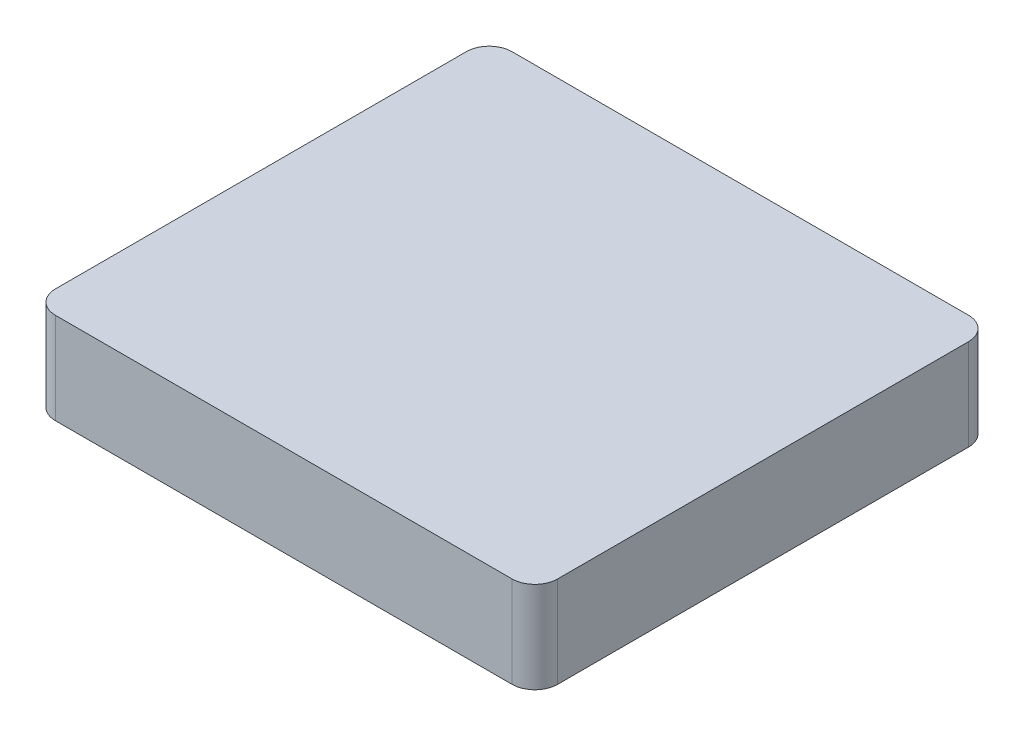
ISO-10303-21;
HEADER;
FILE_DESCRIPTION(('STEP AP214'),'2;1');
FILE_NAME('part.step','',(''),(''),'','','');
FILE_SCHEMA(('AUTOMOTIVE_DESIGN { 1 0 10303 214 1 1 1 1 }'));
ENDSEC;
DATA;
#1=APPLICATION_CONTEXT('core data for automotive mechanical design processes');
#2=APPLICATION_PROTOCOL_DEFINITION('international standard','automotive_design',2000,#1);
#3=PRODUCT_CONTEXT('',#1,'mechanical');
#4=PRODUCT('Part','Part','',(#3));
#5=PRODUCT_RELATED_PRODUCT_CATEGORY('part','',(#4));
#6=PRODUCT_DEFINITION_FORMATION('','',#4);
#7=PRODUCT_DEFINITION_CONTEXT('part definition',#1,'design');
#8=PRODUCT_DEFINITION('design','',#6,#7);
#9=PRODUCT_DEFINITION_SHAPE('','',#8);
#10=(LENGTH_UNIT() NAMED_UNIT(*) SI_UNIT(.MILLI.,.METRE.));
#11=(NAMED_UNIT(*) PLANE_ANGLE_UNIT() SI_UNIT($,.RADIAN.));
#12=(NAMED_UNIT(*) SI_UNIT($,.STERADIAN.) SOLID_ANGLE_UNIT());
#13=UNCERTAINTY_MEASURE_WITH_UNIT(LENGTH_MEASURE(1.E-05),#10,'distance_accuracy_value','');
#14=(GEOMETRIC_REPRESENTATION_CONTEXT(3) GLOBAL_UNCERTAINTY_ASSIGNED_CONTEXT((#13)) GLOBAL_UNIT_ASSIGNED_CONTEXT((#10,
#11,#12)) REPRESENTATION_CONTEXT('',''));
#15=CARTESIAN_POINT('',(0.,0.,0.));
#16=DIRECTION('',(0.,0.,1.));
#17=DIRECTION('',(1.,0.,0.));
#18=AXIS2_PLACEMENT_3D('',#15,#16,#17);
#19=CARTESIAN_POINT('',(0.,2.54,-12.7));
#20=DIRECTION('',(1.,0.,0.));
#21=DIRECTION('',(0.,0.,-1.));
#22=AXIS2_PLACEMENT_3D('',#19,#20,#21);
#23=PLANE('',#22);
#24=DIRECTION('',(0.,0.,1.));
#25=VECTOR('',#24,1.);
#26=CARTESIAN_POINT('',(0.,2.54,-12.7));
#27=LINE('',#26,#25);
#28=CARTESIAN_POINT('',(0.,2.54,-12.065));
#29=VERTEX_POINT('',#28);
#30=CARTESIAN_POINT('',(0.,2.54,-0.635));
#31=VERTEX_POINT('',#30);
#32=EDGE_CURVE('E162',#29,#31,#27,.T.);
#33=ORIENTED_EDGE('',*,*,#32,.F.);
#34=DIRECTION('',(0.,-1.,0.));
#35=VECTOR('',#34,1.);
#36=CARTESIAN_POINT('',(0.,2.54,-12.065));
#37=LINE('',#36,#35);
#38=CARTESIAN_POINT('',(0.,0.,-12.065));
#39=VERTEX_POINT('',#38);
#40=EDGE_CURVE('E187',#29,#39,#37,.T.);
#41=ORIENTED_EDGE('',*,*,#40,.T.);
#42=DIRECTION('',(0.,0.,1.));
#43=VECTOR('',#42,1.);
#44=CARTESIAN_POINT('',(0.,0.,-12.7));
#45=LINE('',#44,#43);
#46=CARTESIAN_POINT('',(0.,0.,-0.635));
#47=VERTEX_POINT('',#46);
#48=EDGE_CURVE('E175',#39,#47,#45,.T.);
#49=ORIENTED_EDGE('',*,*,#48,.T.);
#50=DIRECTION('',(0.,-1.,0.));
#51=VECTOR('',#50,1.);
#52=CARTESIAN_POINT('',(0.,2.54,-0.635));
#53=LINE('',#52,#51);
#54=EDGE_CURVE('E174',#47,#31,#53,.F.);
#55=ORIENTED_EDGE('',*,*,#54,.T.);
#56=EDGE_LOOP('',(#33,#41,#49,#55));
#57=FACE_BOUND('',#56,.T.);
#58=ADVANCED_FACE('F33',(#57),#23,.F.);
#59=CARTESIAN_POINT('',(0.,2.54,0.));
#60=DIRECTION('',(0.,0.,-1.));
#61=DIRECTION('',(-1.,0.,0.));
#62=AXIS2_PLACEMENT_3D('',#59,#60,#61);
#63=PLANE('',#62);
#64=DIRECTION('',(1.,0.,0.));
#65=VECTOR('',#64,1.);
#66=CARTESIAN_POINT('',(0.,0.,0.));
#67=LINE('',#66,#65);
#68=CARTESIAN_POINT('',(0.635,0.,0.));
#69=VERTEX_POINT('',#68);
#70=CARTESIAN_POINT('',(13.335,0.,0.));
#71=VERTEX_POINT('',#70);
#72=EDGE_CURVE('E178',#69,#71,#67,.T.);
#73=ORIENTED_EDGE('',*,*,#72,.T.);
#74=DIRECTION('',(0.,-1.,0.));
#75=VECTOR('',#74,1.);
#76=CARTESIAN_POINT('',(13.335,2.54,0.));
#77=LINE('',#76,#75);
#78=CARTESIAN_POINT('',(13.335,2.54,0.));
#79=VERTEX_POINT('',#78);
#80=EDGE_CURVE('E41',#71,#79,#77,.F.);
#81=ORIENTED_EDGE('',*,*,#80,.T.);
#82=DIRECTION('',(1.,0.,0.));
#83=VECTOR('',#82,1.);
#84=CARTESIAN_POINT('',(0.,2.54,0.));
#85=LINE('',#84,#83);
#86=CARTESIAN_POINT('',(0.635,2.54,0.));
#87=VERTEX_POINT('',#86);
#88=EDGE_CURVE('E165',#87,#79,#85,.T.);
#89=ORIENTED_EDGE('',*,*,#88,.F.);
#90=DIRECTION('',(0.,-1.,0.));
#91=VECTOR('',#90,1.);
#92=CARTESIAN_POINT('',(0.635,2.54,0.));
#93=LINE('',#92,#91);
#94=EDGE_CURVE('E215',#87,#69,#93,.T.);
#95=ORIENTED_EDGE('',*,*,#94,.T.);
#96=EDGE_LOOP('',(#73,#81,#89,#95));
#97=FACE_BOUND('',#96,.T.);
#98=ADVANCED_FACE('F220',(#97),#63,.F.);
#99=CARTESIAN_POINT('',(13.97,2.54,0.));
#100=DIRECTION('',(-1.,0.,0.));
#101=DIRECTION('',(0.,0.,1.));
#102=AXIS2_PLACEMENT_3D('',#99,#100,#101);
#103=PLANE('',#102);
#104=DIRECTION('',(0.,0.,-1.));
#105=VECTOR('',#104,1.);
#106=CARTESIAN_POINT('',(13.97,0.,0.));
#107=LINE('',#106,#105);
#108=CARTESIAN_POINT('',(13.97,0.,-0.635));
#109=VERTEX_POINT('',#108);
#110=CARTESIAN_POINT('',(13.97,0.,-12.065));
#111=VERTEX_POINT('',#110);
#112=EDGE_CURVE('E182',#109,#111,#107,.T.);
#113=ORIENTED_EDGE('',*,*,#112,.T.);
#114=DIRECTION('',(0.,-1.,0.));
#115=VECTOR('',#114,1.);
#116=CARTESIAN_POINT('',(13.97,2.54,-12.065));
#117=LINE('',#116,#115);
#118=CARTESIAN_POINT('',(13.97,2.54,-12.065));
#119=VERTEX_POINT('',#118);
#120=EDGE_CURVE('E56',#111,#119,#117,.F.);
#121=ORIENTED_EDGE('',*,*,#120,.T.);
#122=DIRECTION('',(0.,0.,-1.));
#123=VECTOR('',#122,1.);
#124=CARTESIAN_POINT('',(13.97,2.54,0.));
#125=LINE('',#124,#123);
#126=CARTESIAN_POINT('',(13.97,2.54,-0.635));
#127=VERTEX_POINT('',#126);
#128=EDGE_CURVE('E169',#127,#119,#125,.T.);
#129=ORIENTED_EDGE('',*,*,#128,.F.);
#130=DIRECTION('',(0.,-1.,0.));
#131=VECTOR('',#130,1.);
#132=CARTESIAN_POINT('',(13.97,2.54,-0.635));
#133=LINE('',#132,#131);
#134=EDGE_CURVE('E211',#127,#109,#133,.T.);
#135=ORIENTED_EDGE('',*,*,#134,.T.);
#136=EDGE_LOOP('',(#113,#121,#129,#135));
#137=FACE_BOUND('',#136,.T.);
#138=ADVANCED_FACE('F231',(#137),#103,.F.);
#139=CARTESIAN_POINT('',(13.97,2.54,-12.7));
#140=DIRECTION('',(0.,0.,1.));
#141=DIRECTION('',(1.,0.,0.));
#142=AXIS2_PLACEMENT_3D('',#139,#140,#141);
#143=PLANE('',#142);
#144=DIRECTION('',(-1.,0.,0.));
#145=VECTOR('',#144,1.);
#146=CARTESIAN_POINT('',(13.97,0.,-12.7));
#147=LINE('',#146,#145);
#148=CARTESIAN_POINT('',(13.335,0.,-12.7));
#149=VERTEX_POINT('',#148);
#150=CARTESIAN_POINT('',(0.634999999999995,0.,-12.7));
#151=VERTEX_POINT('',#150);
#152=EDGE_CURVE('E166',#149,#151,#147,.T.);
#153=ORIENTED_EDGE('',*,*,#152,.T.);
#154=DIRECTION('',(0.,-1.,0.));
#155=VECTOR('',#154,1.);
#156=CARTESIAN_POINT('',(0.634999999999995,2.54,-12.7));
#157=LINE('',#156,#155);
#158=CARTESIAN_POINT('',(0.634999999999995,2.54,-12.7));
#159=VERTEX_POINT('',#158);
#160=EDGE_CURVE('E201',#151,#159,#157,.F.);
#161=ORIENTED_EDGE('',*,*,#160,.T.);
#162=DIRECTION('',(-1.,0.,0.));
#163=VECTOR('',#162,1.);
#164=CARTESIAN_POINT('',(13.97,2.54,-12.7));
#165=LINE('',#164,#163);
#166=CARTESIAN_POINT('',(13.335,2.54,-12.7));
#167=VERTEX_POINT('',#166);
#168=EDGE_CURVE('E171',#167,#159,#165,.T.);
#169=ORIENTED_EDGE('',*,*,#168,.F.);
#170=DIRECTION('',(0.,-1.,0.));
#171=VECTOR('',#170,1.);
#172=CARTESIAN_POINT('',(13.335,2.54,-12.7));
#173=LINE('',#172,#171);
#174=EDGE_CURVE('E198',#167,#149,#173,.T.);
#175=ORIENTED_EDGE('',*,*,#174,.T.);
#176=EDGE_LOOP('',(#153,#161,#169,#175));
#177=FACE_BOUND('',#176,.T.);
#178=ADVANCED_FACE('F242',(#177),#143,.F.);
#179=CARTESIAN_POINT('',(0.,2.54,0.));
#180=DIRECTION('',(0.,1.,0.));
#181=DIRECTION('',(0.,0.,1.));
#182=AXIS2_PLACEMENT_3D('',#179,#180,#181);
#183=PLANE('',#182);
#184=ORIENTED_EDGE('',*,*,#168,.T.);
#185=CARTESIAN_POINT('',(0.634999999999995,2.54,-12.065));
#186=DIRECTION('',(0.,1.,0.));
#187=DIRECTION('',(0.,0.,1.));
#188=AXIS2_PLACEMENT_3D('',#185,#186,#187);
#189=CIRCLE('',#188,0.635);
#190=EDGE_CURVE('E209',#159,#29,#189,.T.);
#191=ORIENTED_EDGE('',*,*,#190,.T.);
#192=ORIENTED_EDGE('',*,*,#32,.T.);
#193=CARTESIAN_POINT('',(0.635,2.54,-0.635));
#194=DIRECTION('',(0.,1.,0.));
#195=DIRECTION('',(0.,0.,1.));
#196=AXIS2_PLACEMENT_3D('',#193,#194,#195);
#197=CIRCLE('',#196,0.635);
#198=EDGE_CURVE('E203',#31,#87,#197,.T.);
#199=ORIENTED_EDGE('',*,*,#198,.T.);
#200=ORIENTED_EDGE('',*,*,#88,.T.);
#201=CARTESIAN_POINT('',(13.335,2.54,-0.635));
#202=DIRECTION('',(0.,1.,0.));
#203=DIRECTION('',(0.,0.,1.));
#204=AXIS2_PLACEMENT_3D('',#201,#202,#203);
#205=CIRCLE('',#204,0.635);
#206=EDGE_CURVE('E205',#79,#127,#205,.T.);
#207=ORIENTED_EDGE('',*,*,#206,.T.);
#208=ORIENTED_EDGE('',*,*,#128,.T.);
#209=CARTESIAN_POINT('',(13.335,2.54,-12.065));
#210=DIRECTION('',(0.,1.,0.));
#211=DIRECTION('',(0.,0.,1.));
#212=AXIS2_PLACEMENT_3D('',#209,#210,#211);
#213=CIRCLE('',#212,0.635);
#214=EDGE_CURVE('E207',#119,#167,#213,.T.);
#215=ORIENTED_EDGE('',*,*,#214,.T.);
#216=EDGE_LOOP('',(#184,#191,#192,#199,#200,#207,#208,#215));
#217=FACE_BOUND('',#216,.T.);
#218=ADVANCED_FACE('F226',(#217),#183,.T.);
#219=CARTESIAN_POINT('',(0.,0.,0.));
#220=DIRECTION('',(0.,1.,0.));
#221=DIRECTION('',(0.,0.,1.));
#222=AXIS2_PLACEMENT_3D('',#219,#220,#221);
#223=PLANE('',#222);
#224=DIRECTION('',(-1.,0.,0.));
#225=VECTOR('',#224,1.);
#226=CARTESIAN_POINT('',(13.97,0.,-12.065));
#227=LINE('',#226,#225);
#228=CARTESIAN_POINT('',(13.335,0.,-12.065));
#229=VERTEX_POINT('',#228);
#230=CARTESIAN_POINT('',(0.634999999999995,0.,-12.065));
#231=VERTEX_POINT('',#230);
#232=EDGE_CURVE('E134',#229,#231,#227,.T.);
#233=ORIENTED_EDGE('',*,*,#232,.T.);
#234=DIRECTION('',(0.,0.,1.));
#235=VECTOR('',#234,1.);
#236=CARTESIAN_POINT('',(0.634999999999995,0.,-12.7));
#237=LINE('',#236,#235);
#238=CARTESIAN_POINT('',(0.635,0.,-0.635));
#239=VERTEX_POINT('',#238);
#240=EDGE_CURVE('E140',#231,#239,#237,.T.);
#241=ORIENTED_EDGE('',*,*,#240,.T.);
#242=DIRECTION('',(1.,0.,0.));
#243=VECTOR('',#242,1.);
#244=CARTESIAN_POINT('',(0.,0.,-0.635));
#245=LINE('',#244,#243);
#246=CARTESIAN_POINT('',(13.335,0.,-0.635));
#247=VERTEX_POINT('',#246);
#248=EDGE_CURVE('E156',#239,#247,#245,.T.);
#249=ORIENTED_EDGE('',*,*,#248,.T.);
#250=DIRECTION('',(0.,0.,-1.));
#251=VECTOR('',#250,1.);
#252=CARTESIAN_POINT('',(13.335,0.,0.));
#253=LINE('',#252,#251);
#254=EDGE_CURVE('E48',#247,#229,#253,.T.);
#255=ORIENTED_EDGE('',*,*,#254,.T.);
#256=EDGE_LOOP('',(#233,#241,#249,#255));
#257=FACE_BOUND('',#256,.T.);
#258=ORIENTED_EDGE('',*,*,#48,.F.);
#259=CARTESIAN_POINT('',(0.634999999999995,0.,-12.065));
#260=DIRECTION('',(0.,1.,0.));
#261=DIRECTION('',(0.,0.,1.));
#262=AXIS2_PLACEMENT_3D('',#259,#260,#261);
#263=CIRCLE('',#262,0.635);
#264=EDGE_CURVE('E196',#39,#151,#263,.F.);
#265=ORIENTED_EDGE('',*,*,#264,.T.);
#266=ORIENTED_EDGE('',*,*,#152,.F.);
#267=CARTESIAN_POINT('',(13.335,0.,-12.065));
#268=DIRECTION('',(0.,1.,0.));
#269=DIRECTION('',(0.,0.,1.));
#270=AXIS2_PLACEMENT_3D('',#267,#268,#269);
#271=CIRCLE('',#270,0.635);
#272=EDGE_CURVE('E194',#149,#111,#271,.F.);
#273=ORIENTED_EDGE('',*,*,#272,.T.);
#274=ORIENTED_EDGE('',*,*,#112,.F.);
#275=CARTESIAN_POINT('',(13.335,0.,-0.635));
#276=DIRECTION('',(0.,1.,0.));
#277=DIRECTION('',(0.,0.,1.));
#278=AXIS2_PLACEMENT_3D('',#275,#276,#277);
#279=CIRCLE('',#278,0.635);
#280=EDGE_CURVE('E192',#109,#71,#279,.F.);
#281=ORIENTED_EDGE('',*,*,#280,.T.);
#282=ORIENTED_EDGE('',*,*,#72,.F.);
#283=CARTESIAN_POINT('',(0.635,0.,-0.635));
#284=DIRECTION('',(0.,1.,0.));
#285=DIRECTION('',(0.,0.,1.));
#286=AXIS2_PLACEMENT_3D('',#283,#284,#285);
#287=CIRCLE('',#286,0.635);
#288=EDGE_CURVE('E190',#69,#47,#287,.F.);
#289=ORIENTED_EDGE('',*,*,#288,.T.);
#290=EDGE_LOOP('',(#258,#265,#266,#273,#274,#281,#282,#289));
#291=FACE_BOUND('',#290,.T.);
#292=ADVANCED_FACE('F234',(#257,#291),#223,.F.);
#293=CARTESIAN_POINT('',(0.634999999999995,2.54,-12.065));
#294=DIRECTION('',(0.,-1.,0.));
#295=DIRECTION('',(0.,0.,-1.));
#296=AXIS2_PLACEMENT_3D('',#293,#294,#295);
#297=CYLINDRICAL_SURFACE('',#296,0.635);
#298=ORIENTED_EDGE('',*,*,#190,.F.);
#299=ORIENTED_EDGE('',*,*,#160,.F.);
#300=ORIENTED_EDGE('',*,*,#264,.F.);
#301=ORIENTED_EDGE('',*,*,#40,.F.);
#302=EDGE_LOOP('',(#298,#299,#300,#301));
#303=FACE_BOUND('',#302,.T.);
#304=ADVANCED_FACE('F248',(#303),#297,.T.);
#305=CARTESIAN_POINT('',(13.335,2.54,-12.065));
#306=DIRECTION('',(0.,-1.,0.));
#307=DIRECTION('',(0.,0.,-1.));
#308=AXIS2_PLACEMENT_3D('',#305,#306,#307);
#309=CYLINDRICAL_SURFACE('',#308,0.635);
#310=ORIENTED_EDGE('',*,*,#214,.F.);
#311=ORIENTED_EDGE('',*,*,#120,.F.);
#312=ORIENTED_EDGE('',*,*,#272,.F.);
#313=ORIENTED_EDGE('',*,*,#174,.F.);
#314=EDGE_LOOP('',(#310,#311,#312,#313));
#315=FACE_BOUND('',#314,.T.);
#316=ADVANCED_FACE('F239',(#315),#309,.T.);
#317=CARTESIAN_POINT('',(13.335,2.54,-0.635));
#318=DIRECTION('',(0.,-1.,0.));
#319=DIRECTION('',(0.,0.,-1.));
#320=AXIS2_PLACEMENT_3D('',#317,#318,#319);
#321=CYLINDRICAL_SURFACE('',#320,0.635);
#322=ORIENTED_EDGE('',*,*,#206,.F.);
#323=ORIENTED_EDGE('',*,*,#80,.F.);
#324=ORIENTED_EDGE('',*,*,#280,.F.);
#325=ORIENTED_EDGE('',*,*,#134,.F.);
#326=EDGE_LOOP('',(#322,#323,#324,#325));
#327=FACE_BOUND('',#326,.T.);
#328=ADVANCED_FACE('F229',(#327),#321,.T.);
#329=CARTESIAN_POINT('',(0.635,2.54,-0.635));
#330=DIRECTION('',(0.,-1.,0.));
#331=DIRECTION('',(0.,0.,-1.));
#332=AXIS2_PLACEMENT_3D('',#329,#330,#331);
#333=CYLINDRICAL_SURFACE('',#332,0.635);
#334=ORIENTED_EDGE('',*,*,#198,.F.);
#335=ORIENTED_EDGE('',*,*,#54,.F.);
#336=ORIENTED_EDGE('',*,*,#288,.F.);
#337=ORIENTED_EDGE('',*,*,#94,.F.);
#338=EDGE_LOOP('',(#334,#335,#336,#337));
#339=FACE_BOUND('',#338,.T.);
#340=ADVANCED_FACE('F35',(#339),#333,.T.);
#341=CARTESIAN_POINT('',(0.634999999999995,2.54,-12.7));
#342=DIRECTION('',(1.,0.,0.));
#343=DIRECTION('',(0.,0.,-1.));
#344=AXIS2_PLACEMENT_3D('',#341,#342,#343);
#345=PLANE('',#344);
#346=DIRECTION('',(0.,0.,1.));
#347=VECTOR('',#346,1.);
#348=CARTESIAN_POINT('',(0.634999999999995,1.905,-12.7));
#349=LINE('',#348,#347);
#350=CARTESIAN_POINT('',(0.634999999999995,1.905,-12.065));
#351=VERTEX_POINT('',#350);
#352=CARTESIAN_POINT('',(0.635,1.905,-0.635));
#353=VERTEX_POINT('',#352);
#354=EDGE_CURVE('E124',#351,#353,#349,.T.);
#355=ORIENTED_EDGE('',*,*,#354,.T.);
#356=DIRECTION('',(0.,1.,0.));
#357=VECTOR('',#356,1.);
#358=CARTESIAN_POINT('',(0.635,2.54,-0.635));
#359=LINE('',#358,#357);
#360=EDGE_CURVE('E145',#239,#353,#359,.T.);
#361=ORIENTED_EDGE('',*,*,#360,.F.);
#362=ORIENTED_EDGE('',*,*,#240,.F.);
#363=DIRECTION('',(0.,1.,0.));
#364=VECTOR('',#363,1.);
#365=CARTESIAN_POINT('',(0.634999999999995,2.54,-12.065));
#366=LINE('',#365,#364);
#367=EDGE_CURVE('E137',#231,#351,#366,.T.);
#368=ORIENTED_EDGE('',*,*,#367,.T.);
#369=EDGE_LOOP('',(#355,#361,#362,#368));
#370=FACE_BOUND('',#369,.T.);
#371=ADVANCED_FACE('F138',(#370),#345,.T.);
#372=CARTESIAN_POINT('',(0.,2.54,-0.635));
#373=DIRECTION('',(0.,0.,-1.));
#374=DIRECTION('',(-1.,0.,0.));
#375=AXIS2_PLACEMENT_3D('',#372,#373,#374);
#376=PLANE('',#375);
#377=ORIENTED_EDGE('',*,*,#248,.F.);
#378=ORIENTED_EDGE('',*,*,#360,.T.);
#379=DIRECTION('',(1.,0.,0.));
#380=VECTOR('',#379,1.);
#381=CARTESIAN_POINT('',(0.,1.905,-0.635));
#382=LINE('',#381,#380);
#383=CARTESIAN_POINT('',(13.335,1.905,-0.635));
#384=VERTEX_POINT('',#383);
#385=EDGE_CURVE('E131',#353,#384,#382,.T.);
#386=ORIENTED_EDGE('',*,*,#385,.T.);
#387=DIRECTION('',(0.,1.,0.));
#388=VECTOR('',#387,1.);
#389=CARTESIAN_POINT('',(13.335,2.54,-0.635));
#390=LINE('',#389,#388);
#391=EDGE_CURVE('E179',#247,#384,#390,.T.);
#392=ORIENTED_EDGE('',*,*,#391,.F.);
#393=EDGE_LOOP('',(#377,#378,#386,#392));
#394=FACE_BOUND('',#393,.T.);
#395=ADVANCED_FACE('F257',(#394),#376,.T.);
#396=CARTESIAN_POINT('',(13.335,2.54,0.));
#397=DIRECTION('',(-1.,0.,0.));
#398=DIRECTION('',(0.,0.,1.));
#399=AXIS2_PLACEMENT_3D('',#396,#397,#398);
#400=PLANE('',#399);
#401=ORIENTED_EDGE('',*,*,#254,.F.);
#402=ORIENTED_EDGE('',*,*,#391,.T.);
#403=DIRECTION('',(0.,0.,-1.));
#404=VECTOR('',#403,1.);
#405=CARTESIAN_POINT('',(13.335,1.905,0.));
#406=LINE('',#405,#404);
#407=CARTESIAN_POINT('',(13.335,1.905,-12.065));
#408=VERTEX_POINT('',#407);
#409=EDGE_CURVE('E149',#384,#408,#406,.T.);
#410=ORIENTED_EDGE('',*,*,#409,.T.);
#411=DIRECTION('',(0.,1.,0.));
#412=VECTOR('',#411,1.);
#413=CARTESIAN_POINT('',(13.335,2.54,-12.065));
#414=LINE('',#413,#412);
#415=EDGE_CURVE('E144',#229,#408,#414,.T.);
#416=ORIENTED_EDGE('',*,*,#415,.F.);
#417=EDGE_LOOP('',(#401,#402,#410,#416));
#418=FACE_BOUND('',#417,.T.);
#419=ADVANCED_FACE('F309',(#418),#400,.T.);
#420=CARTESIAN_POINT('',(13.97,2.54,-12.065));
#421=DIRECTION('',(0.,0.,1.));
#422=DIRECTION('',(1.,0.,0.));
#423=AXIS2_PLACEMENT_3D('',#420,#421,#422);
#424=PLANE('',#423);
#425=ORIENTED_EDGE('',*,*,#232,.F.);
#426=ORIENTED_EDGE('',*,*,#415,.T.);
#427=DIRECTION('',(-1.,0.,0.));
#428=VECTOR('',#427,1.);
#429=CARTESIAN_POINT('',(13.97,1.905,-12.065));
#430=LINE('',#429,#428);
#431=EDGE_CURVE('E128',#408,#351,#430,.T.);
#432=ORIENTED_EDGE('',*,*,#431,.T.);
#433=ORIENTED_EDGE('',*,*,#367,.F.);
#434=EDGE_LOOP('',(#425,#426,#432,#433));
#435=FACE_BOUND('',#434,.T.);
#436=ADVANCED_FACE('F147',(#435),#424,.T.);
#437=CARTESIAN_POINT('',(0.,1.905,0.));
#438=DIRECTION('',(0.,1.,0.));
#439=DIRECTION('',(0.,0.,1.));
#440=AXIS2_PLACEMENT_3D('',#437,#438,#439);
#441=PLANE('',#440);
#442=CARTESIAN_POINT('',(6.98499999999999,1.905,-6.35));
#443=DIRECTION('',(0.,1.,0.));
#444=DIRECTION('',(0.,0.,1.));
#445=AXIS2_PLACEMENT_3D('',#442,#443,#444);
#446=CIRCLE('',#445,2.54);
#447=CARTESIAN_POINT('',(6.98499999999999,1.905,-3.81));
#448=VERTEX_POINT('',#447);
#449=EDGE_CURVE('E11',#448,#448,#446,.F.);
#450=ORIENTED_EDGE('',*,*,#449,.F.);
#451=EDGE_LOOP('',(#450));
#452=FACE_BOUND('',#451,.T.);
#453=ORIENTED_EDGE('',*,*,#431,.F.);
#454=ORIENTED_EDGE('',*,*,#409,.F.);
#455=ORIENTED_EDGE('',*,*,#385,.F.);
#456=ORIENTED_EDGE('',*,*,#354,.F.);
#457=EDGE_LOOP('',(#453,#454,#455,#456));
#458=FACE_BOUND('',#457,.T.);
#459=ADVANCED_FACE('F126',(#452,#458),#441,.F.);
#460=CARTESIAN_POINT('',(6.98499999999999,-7.18420489685532,-6.35));
#461=DIRECTION('',(0.,1.,0.));
#462=DIRECTION('',(0.,0.,1.));
#463=AXIS2_PLACEMENT_3D('',#460,#461,#462);
#464=CYLINDRICAL_SURFACE('',#463,2.54);
#465=CARTESIAN_POINT('',(6.98499999999999,0.,-6.35));
#466=DIRECTION('',(0.,1.,0.));
#467=DIRECTION('',(0.,0.,1.));
#468=AXIS2_PLACEMENT_3D('',#465,#466,#467);
#469=CIRCLE('',#468,2.54);
#470=CARTESIAN_POINT('',(6.98499999999999,0.,-3.81));
#471=VERTEX_POINT('',#470);
#472=EDGE_CURVE('E157',#471,#471,#469,.T.);
#473=CARTESIAN_POINT('',(6.98499999999999,0.,-3.81));
#474=CARTESIAN_POINT('',(6.98499999999999,0.0198437499999991,-3.81));
#475=CARTESIAN_POINT('',(6.98499999999999,0.0396874999999989,-3.81));
#476=CARTESIAN_POINT('',(6.98499999999999,0.079374999999999,-3.81));
#477=CARTESIAN_POINT('',(6.98499999999999,0.0992187499999992,-3.81));
#478=CARTESIAN_POINT('',(6.98499999999999,0.138906249999999,-3.81));
#479=CARTESIAN_POINT('',(6.98499999999999,0.158749999999999,-3.81));
#480=CARTESIAN_POINT('',(6.98499999999999,0.198437499999999,-3.81));
#481=CARTESIAN_POINT('',(6.98499999999999,0.218281249999999,-3.81));
#482=CARTESIAN_POINT('',(6.98499999999999,0.25796875,-3.81));
#483=CARTESIAN_POINT('',(6.98499999999999,0.277812499999999,-3.81));
#484=CARTESIAN_POINT('',(6.98499999999999,0.317499999999999,-3.81));
#485=CARTESIAN_POINT('',(6.98499999999999,0.337343749999999,-3.81));
#486=CARTESIAN_POINT('',(6.98499999999999,0.377031249999999,-3.81));
#487=CARTESIAN_POINT('',(6.98499999999999,0.396874999999999,-3.81));
#488=CARTESIAN_POINT('',(6.98499999999999,0.436562499999999,-3.81));
#489=CARTESIAN_POINT('',(6.98499999999999,0.456406249999999,-3.81));
#490=CARTESIAN_POINT('',(6.98499999999999,0.496093749999999,-3.81));
#491=CARTESIAN_POINT('',(6.98499999999999,0.515937499999999,-3.81));
#492=CARTESIAN_POINT('',(6.98499999999999,0.555624999999999,-3.81));
#493=CARTESIAN_POINT('',(6.98499999999999,0.575468749999999,-3.81));
#494=CARTESIAN_POINT('',(6.98499999999999,0.615156249999999,-3.81));
#495=CARTESIAN_POINT('',(6.98499999999999,0.634999999999999,-3.81));
#496=CARTESIAN_POINT('',(6.98499999999999,0.674687499999998,-3.81));
#497=CARTESIAN_POINT('',(6.98499999999999,0.694531249999998,-3.81));
#498=CARTESIAN_POINT('',(6.98499999999999,0.734218749999998,-3.81));
#499=CARTESIAN_POINT('',(6.98499999999999,0.754062499999998,-3.81));
#500=CARTESIAN_POINT('',(6.98499999999999,0.793749999999998,-3.81));
#501=CARTESIAN_POINT('',(6.98499999999999,0.813593749999999,-3.81));
#502=CARTESIAN_POINT('',(6.98499999999999,0.853281249999999,-3.81));
#503=CARTESIAN_POINT('',(6.98499999999999,0.873124999999999,-3.81));
#504=CARTESIAN_POINT('',(6.98499999999999,0.912812499999999,-3.81));
#505=CARTESIAN_POINT('',(6.98499999999999,0.932656249999999,-3.81));
#506=CARTESIAN_POINT('',(6.98499999999999,0.972343749999998,-3.81));
#507=CARTESIAN_POINT('',(6.98499999999999,0.992187499999998,-3.81));
#508=CARTESIAN_POINT('',(6.98499999999999,1.031875,-3.81));
#509=CARTESIAN_POINT('',(6.98499999999999,1.05171875,-3.81));
#510=CARTESIAN_POINT('',(6.98499999999999,1.09140625,-3.81));
#511=CARTESIAN_POINT('',(6.98499999999999,1.11125,-3.81));
#512=CARTESIAN_POINT('',(6.98499999999999,1.1509375,-3.81));
#513=CARTESIAN_POINT('',(6.98499999999999,1.17078125,-3.81));
#514=CARTESIAN_POINT('',(6.98499999999999,1.21046875,-3.81));
#515=CARTESIAN_POINT('',(6.98499999999999,1.2303125,-3.81));
#516=CARTESIAN_POINT('',(6.98499999999999,1.27,-3.81));
#517=CARTESIAN_POINT('',(6.98499999999999,1.28984375,-3.81));
#518=CARTESIAN_POINT('',(6.98499999999999,1.32953125,-3.81));
#519=CARTESIAN_POINT('',(6.98499999999999,1.349375,-3.81));
#520=CARTESIAN_POINT('',(6.98499999999999,1.3890625,-3.81));
#521=CARTESIAN_POINT('',(6.98499999999999,1.40890625,-3.81));
#522=CARTESIAN_POINT('',(6.98499999999999,1.44859375,-3.81));
#523=CARTESIAN_POINT('',(6.98499999999999,1.4684375,-3.81));
#524=CARTESIAN_POINT('',(6.98499999999999,1.508125,-3.81));
#525=CARTESIAN_POINT('',(6.98499999999999,1.52796875,-3.81));
#526=CARTESIAN_POINT('',(6.98499999999999,1.56765625,-3.81));
#527=CARTESIAN_POINT('',(6.98499999999999,1.5875,-3.81));
#528=CARTESIAN_POINT('',(6.98499999999999,1.6271875,-3.81));
#529=CARTESIAN_POINT('',(6.98499999999999,1.64703125,-3.81));
#530=CARTESIAN_POINT('',(6.98499999999999,1.68671875,-3.81));
#531=CARTESIAN_POINT('',(6.98499999999999,1.7065625,-3.81));
#532=CARTESIAN_POINT('',(6.98499999999999,1.74625,-3.81));
#533=CARTESIAN_POINT('',(6.98499999999999,1.76609375,-3.81));
#534=CARTESIAN_POINT('',(6.98499999999999,1.80578125,-3.81));
#535=CARTESIAN_POINT('',(6.98499999999999,1.825625,-3.81));
#536=CARTESIAN_POINT('',(6.98499999999999,1.8653125,-3.81));
#537=CARTESIAN_POINT('',(6.98499999999999,1.88515625,-3.81));
#538=CARTESIAN_POINT('',(6.98499999999999,1.905,-3.81));
#539=B_SPLINE_CURVE_WITH_KNOTS('',3,(#473,#474,#475,#476,#477,#478,#479,#480,#481,#482,#483,
#484,#485,#486,#487,#488,#489,#490,#491,#492,#493,#494,#495,#496,#497,#498,#499,#500,#501,#502,
#503,#504,#505,#506,#507,#508,#509,#510,#511,#512,#513,#514,#515,#516,#517,#518,#519,#520,#521,
#522,#523,#524,#525,#526,#527,#528,#529,#530,#531,#532,#533,#534,#535,#536,#537,#538),
.UNSPECIFIED.,.F.,.F.,(4,2,2,2,2,2,2,2,2,2,2,2,2,2,2,2,2,2,2,2,2,2,2,2,2,2,2,2,2,2,2,2,4),(0.,
0.0595312499999997,0.1190625,0.17859375,0.238125,0.29765625,0.3571875,0.41671875,0.47625,
0.53578125,0.5953125,0.654843749999999,0.714374999999999,0.773906249999999,0.8334375,0.89296875,
0.952499999999999,1.01203125,1.0715625,1.13109375,1.190625,1.25015625,1.3096875,1.36921875,
1.42875,1.48828125,1.5478125,1.60734375,1.666875,1.72640625,1.7859375,1.84546875,1.905),.UNSPECIFIED.);
#540=EDGE_CURVE('BSEAM335',#471,#448,#539,.T.);
#541=ORIENTED_EDGE('',*,*,#472,.T.);
#542=ORIENTED_EDGE('',*,*,#449,.T.);
#543=ORIENTED_EDGE('',*,*,#540,.T.);
#544=ORIENTED_EDGE('',*,*,#540,.F.);
#545=EDGE_LOOP('',(#541,#543,#542,#544));
#546=FACE_BOUND('',#545,.T.);
#547=ADVANCED_FACE('F335',(#546),#464,.T.);
#548=CARTESIAN_POINT('',(0.,0.,0.));
#549=DIRECTION('',(0.,1.,0.));
#550=DIRECTION('',(0.,0.,1.));
#551=AXIS2_PLACEMENT_3D('',#548,#549,#550);
#552=PLANE('',#551);
#553=ORIENTED_EDGE('',*,*,#472,.F.);
#554=EDGE_LOOP('',(#553));
#555=FACE_BOUND('',#554,.T.);
#556=ADVANCED_FACE('F345',(#555),#552,.F.);
#557=CLOSED_SHELL('',(#58,#98,#138,#178,#218,#292,#304,#316,#328,#340,#371,#395,#419,#436,#459,
#547,#556));
#558=MANIFOLD_SOLID_BREP('B2',#557);
#559=ADVANCED_BREP_SHAPE_REPRESENTATION('',(#18,#558),#14);
#560=SHAPE_DEFINITION_REPRESENTATION(#9,#559);
ENDSEC;
END-ISO-10303-21;
